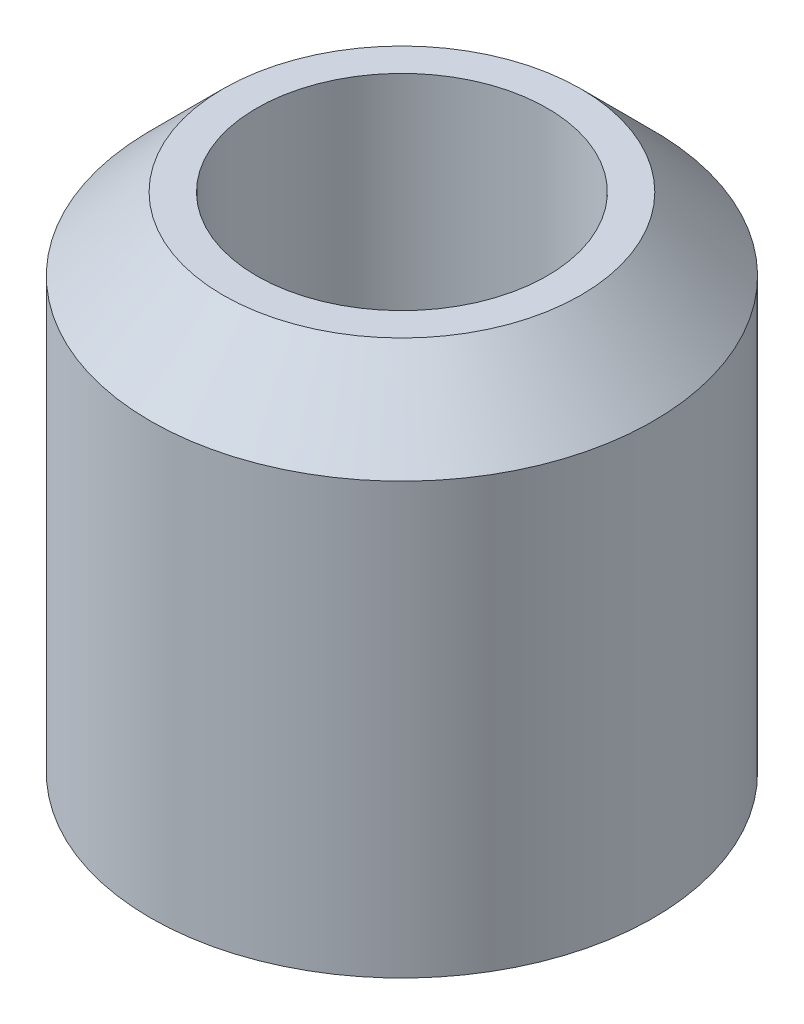
ISO-10303-21;
HEADER;
FILE_DESCRIPTION(('STEP AP214'),'2;1');
FILE_NAME('part.step','',(''),(''),'','','');
FILE_SCHEMA(('AUTOMOTIVE_DESIGN { 1 0 10303 214 1 1 1 1 }'));
ENDSEC;
DATA;
#1=APPLICATION_CONTEXT('core data for automotive mechanical design processes');
#2=APPLICATION_PROTOCOL_DEFINITION('international standard','automotive_design',2000,#1);
#3=PRODUCT_CONTEXT('',#1,'mechanical');
#4=PRODUCT('Part','Part','',(#3));
#5=PRODUCT_RELATED_PRODUCT_CATEGORY('part','',(#4));
#6=PRODUCT_DEFINITION_FORMATION('','',#4);
#7=PRODUCT_DEFINITION_CONTEXT('part definition',#1,'design');
#8=PRODUCT_DEFINITION('design','',#6,#7);
#9=PRODUCT_DEFINITION_SHAPE('','',#8);
#10=(LENGTH_UNIT() NAMED_UNIT(*) SI_UNIT(.MILLI.,.METRE.));
#11=(NAMED_UNIT(*) PLANE_ANGLE_UNIT() SI_UNIT($,.RADIAN.));
#12=(NAMED_UNIT(*) SI_UNIT($,.STERADIAN.) SOLID_ANGLE_UNIT());
#13=UNCERTAINTY_MEASURE_WITH_UNIT(LENGTH_MEASURE(1.E-05),#10,'distance_accuracy_value','');
#14=(GEOMETRIC_REPRESENTATION_CONTEXT(3) GLOBAL_UNCERTAINTY_ASSIGNED_CONTEXT((#13)) GLOBAL_UNIT_ASSIGNED_CONTEXT((#10,
#11,#12)) REPRESENTATION_CONTEXT('',''));
#15=CARTESIAN_POINT('',(0.,0.,0.));
#16=DIRECTION('',(0.,0.,1.));
#17=DIRECTION('',(1.,0.,0.));
#18=AXIS2_PLACEMENT_3D('',#15,#16,#17);
#19=CARTESIAN_POINT('',(0.,9.,0.));
#20=DIRECTION('',(0.,1.,0.));
#21=DIRECTION('',(0.,0.,1.));
#22=AXIS2_PLACEMENT_3D('',#19,#20,#21);
#23=PLANE('',#22);
#24=CARTESIAN_POINT('',(0.,9.,0.));
#25=DIRECTION('',(0.,1.,0.));
#26=DIRECTION('',(0.,0.,1.));
#27=AXIS2_PLACEMENT_3D('',#24,#25,#26);
#28=CIRCLE('',#27,3.2);
#29=CARTESIAN_POINT('',(0.,9.,3.2));
#30=VERTEX_POINT('',#29);
#31=EDGE_CURVE('E22',#30,#30,#28,.T.);
#32=ORIENTED_EDGE('',*,*,#31,.T.);
#33=EDGE_LOOP('',(#32));
#34=FACE_BOUND('',#33,.T.);
#35=CARTESIAN_POINT('',(0.,9.,0.));
#36=DIRECTION('',(0.,1.,0.));
#37=DIRECTION('',(0.,0.,1.));
#38=AXIS2_PLACEMENT_3D('',#35,#36,#37);
#39=CIRCLE('',#38,2.6);
#40=CARTESIAN_POINT('',(0.,9.,2.6));
#41=VERTEX_POINT('',#40);
#42=EDGE_CURVE('E30',#41,#41,#39,.T.);
#43=ORIENTED_EDGE('',*,*,#42,.F.);
#44=EDGE_LOOP('',(#43));
#45=FACE_BOUND('',#44,.T.);
#46=ADVANCED_FACE('F15',(#34,#45),#23,.T.);
#47=CARTESIAN_POINT('',(0.,0.,0.));
#48=DIRECTION('',(0.,1.,0.));
#49=DIRECTION('',(0.,0.,1.));
#50=AXIS2_PLACEMENT_3D('',#47,#48,#49);
#51=PLANE('',#50);
#52=CARTESIAN_POINT('',(0.,0.,0.));
#53=DIRECTION('',(0.,1.,0.));
#54=DIRECTION('',(0.,0.,1.));
#55=AXIS2_PLACEMENT_3D('',#52,#53,#54);
#56=CIRCLE('',#55,4.5);
#57=CARTESIAN_POINT('',(0.,0.,4.5));
#58=VERTEX_POINT('',#57);
#59=EDGE_CURVE('E26',#58,#58,#56,.T.);
#60=ORIENTED_EDGE('',*,*,#59,.F.);
#61=EDGE_LOOP('',(#60));
#62=FACE_BOUND('',#61,.T.);
#63=CARTESIAN_POINT('',(0.,0.,0.));
#64=DIRECTION('',(0.,1.,0.));
#65=DIRECTION('',(0.,0.,1.));
#66=AXIS2_PLACEMENT_3D('',#63,#64,#65);
#67=CIRCLE('',#66,2.6);
#68=CARTESIAN_POINT('',(0.,0.,2.6));
#69=VERTEX_POINT('',#68);
#70=EDGE_CURVE('E33',#69,#69,#67,.T.);
#71=ORIENTED_EDGE('',*,*,#70,.T.);
#72=EDGE_LOOP('',(#71));
#73=FACE_BOUND('',#72,.T.);
#74=ADVANCED_FACE('F43',(#62,#73),#51,.F.);
#75=CARTESIAN_POINT('',(0.,9.,0.));
#76=DIRECTION('',(0.,-1.,0.));
#77=DIRECTION('',(0.,0.,-1.));
#78=AXIS2_PLACEMENT_3D('',#75,#76,#77);
#79=CYLINDRICAL_SURFACE('',#78,4.5);
#80=CARTESIAN_POINT('',(0.,7.7,0.));
#81=DIRECTION('',(0.,1.,0.));
#82=DIRECTION('',(0.,0.,1.));
#83=AXIS2_PLACEMENT_3D('',#80,#81,#82);
#84=CIRCLE('',#83,4.5);
#85=CARTESIAN_POINT('',(0.,7.7,4.5));
#86=VERTEX_POINT('',#85);
#87=EDGE_CURVE('E10',#86,#86,#84,.F.);
#88=ORIENTED_EDGE('',*,*,#87,.T.);
#89=EDGE_LOOP('',(#88));
#90=FACE_BOUND('',#89,.T.);
#91=ORIENTED_EDGE('',*,*,#59,.T.);
#92=EDGE_LOOP('',(#91));
#93=FACE_BOUND('',#92,.T.);
#94=ADVANCED_FACE('F50',(#90,#93),#79,.T.);
#95=CARTESIAN_POINT('',(0.,9.,0.));
#96=DIRECTION('',(0.,-1.,0.));
#97=DIRECTION('',(0.,0.,-1.));
#98=AXIS2_PLACEMENT_3D('',#95,#96,#97);
#99=CYLINDRICAL_SURFACE('',#98,2.6);
#100=ORIENTED_EDGE('',*,*,#42,.T.);
#101=EDGE_LOOP('',(#100));
#102=FACE_BOUND('',#101,.T.);
#103=ORIENTED_EDGE('',*,*,#70,.F.);
#104=EDGE_LOOP('',(#103));
#105=FACE_BOUND('',#104,.T.);
#106=ADVANCED_FACE('F39',(#102,#105),#99,.F.);
#107=CARTESIAN_POINT('',(0.,9.,0.));
#108=DIRECTION('',(0.,-1.,0.));
#109=DIRECTION('',(0.,0.,-1.));
#110=AXIS2_PLACEMENT_3D('',#107,#108,#109);
#111=CONICAL_SURFACE('',#110,3.2,0.785398163397446);
#112=ORIENTED_EDGE('',*,*,#87,.F.);
#113=EDGE_LOOP('',(#112));
#114=FACE_BOUND('',#113,.T.);
#115=ORIENTED_EDGE('',*,*,#31,.F.);
#116=EDGE_LOOP('',(#115));
#117=FACE_BOUND('',#116,.T.);
#118=ADVANCED_FACE('F17',(#114,#117),#111,.T.);
#119=CLOSED_SHELL('',(#46,#74,#94,#106,#118));
#120=MANIFOLD_SOLID_BREP('B1',#119);
#121=ADVANCED_BREP_SHAPE_REPRESENTATION('',(#18,#120),#14);
#122=SHAPE_DEFINITION_REPRESENTATION(#9,#121);
ENDSEC;
END-ISO-10303-21;
